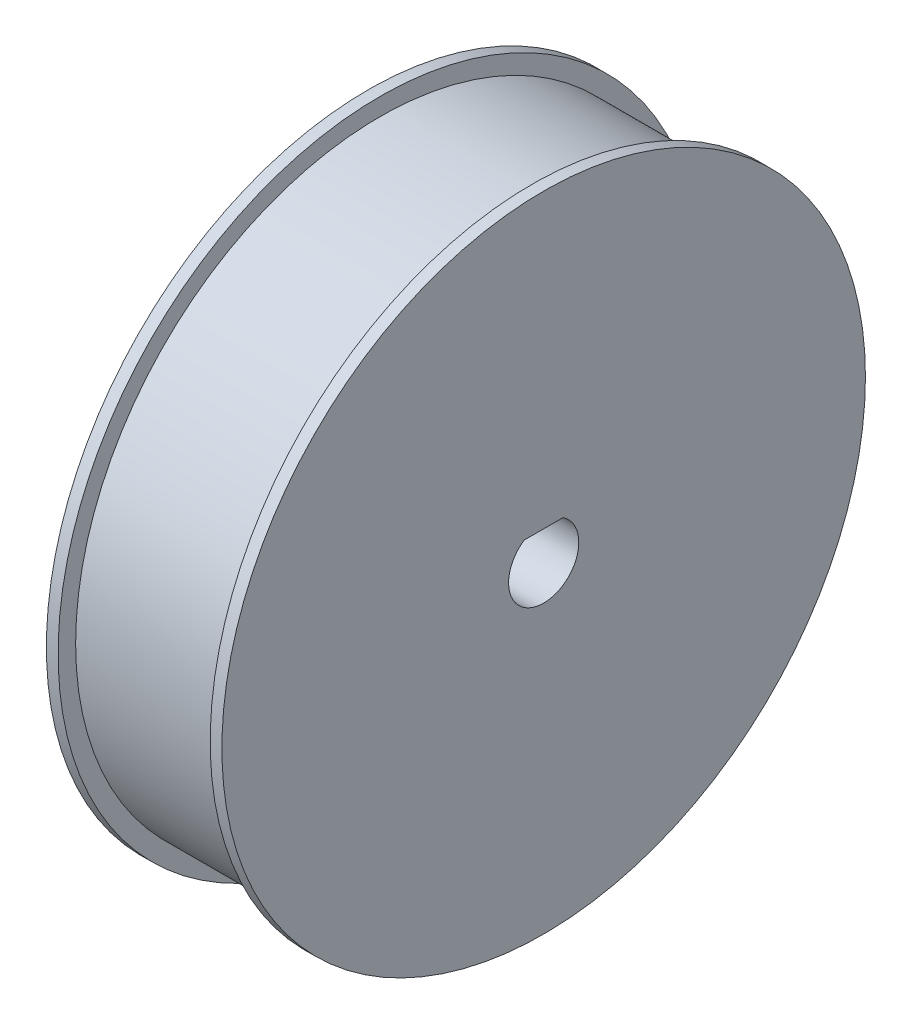
ISO-10303-21;
HEADER;
FILE_DESCRIPTION(('STEP AP214'),'2;1');
FILE_NAME('part.step','',(''),(''),'','','');
FILE_SCHEMA(('AUTOMOTIVE_DESIGN { 1 0 10303 214 1 1 1 1 }'));
ENDSEC;
DATA;
#1=APPLICATION_CONTEXT('core data for automotive mechanical design processes');
#2=APPLICATION_PROTOCOL_DEFINITION('international standard','automotive_design',2000,#1);
#3=PRODUCT_CONTEXT('',#1,'mechanical');
#4=PRODUCT('Part','Part','',(#3));
#5=PRODUCT_RELATED_PRODUCT_CATEGORY('part','',(#4));
#6=PRODUCT_DEFINITION_FORMATION('','',#4);
#7=PRODUCT_DEFINITION_CONTEXT('part definition',#1,'design');
#8=PRODUCT_DEFINITION('design','',#6,#7);
#9=PRODUCT_DEFINITION_SHAPE('','',#8);
#10=(LENGTH_UNIT() NAMED_UNIT(*) SI_UNIT(.MILLI.,.METRE.));
#11=(NAMED_UNIT(*) PLANE_ANGLE_UNIT() SI_UNIT($,.RADIAN.));
#12=(NAMED_UNIT(*) SI_UNIT($,.STERADIAN.) SOLID_ANGLE_UNIT());
#13=UNCERTAINTY_MEASURE_WITH_UNIT(LENGTH_MEASURE(1.E-05),#10,'distance_accuracy_value','');
#14=(GEOMETRIC_REPRESENTATION_CONTEXT(3) GLOBAL_UNCERTAINTY_ASSIGNED_CONTEXT((#13)) GLOBAL_UNIT_ASSIGNED_CONTEXT((#10,
#11,#12)) REPRESENTATION_CONTEXT('',''));
#15=CARTESIAN_POINT('',(0.,0.,0.));
#16=DIRECTION('',(0.,0.,1.));
#17=DIRECTION('',(1.,0.,0.));
#18=AXIS2_PLACEMENT_3D('',#15,#16,#17);
#19=CARTESIAN_POINT('',(-5.,0.,0.));
#20=DIRECTION('',(1.,0.,0.));
#21=DIRECTION('',(0.,0.,-1.));
#22=AXIS2_PLACEMENT_3D('',#19,#20,#21);
#23=CYLINDRICAL_SURFACE('',#22,27.5);
#24=CARTESIAN_POINT('',(-5.,0.,0.));
#25=DIRECTION('',(1.,0.,0.));
#26=DIRECTION('',(0.,0.,-1.));
#27=AXIS2_PLACEMENT_3D('',#24,#25,#26);
#28=CIRCLE('',#27,27.5);
#29=CARTESIAN_POINT('',(-5.,0.,-27.5));
#30=VERTEX_POINT('',#29);
#31=EDGE_CURVE('E11',#30,#30,#28,.T.);
#32=ORIENTED_EDGE('',*,*,#31,.T.);
#33=EDGE_LOOP('',(#32));
#34=FACE_BOUND('',#33,.T.);
#35=CARTESIAN_POINT('',(-4.,0.,0.));
#36=DIRECTION('',(1.,0.,0.));
#37=DIRECTION('',(0.,0.,-1.));
#38=AXIS2_PLACEMENT_3D('',#35,#36,#37);
#39=CIRCLE('',#38,27.5);
#40=CARTESIAN_POINT('',(-4.,0.,-27.5));
#41=VERTEX_POINT('',#40);
#42=EDGE_CURVE('E93',#41,#41,#39,.T.);
#43=ORIENTED_EDGE('',*,*,#42,.F.);
#44=EDGE_LOOP('',(#43));
#45=FACE_BOUND('',#44,.T.);
#46=ADVANCED_FACE('F33',(#34,#45),#23,.T.);
#47=CARTESIAN_POINT('',(9.,0.,0.));
#48=DIRECTION('',(1.,0.,0.));
#49=DIRECTION('',(0.,0.,-1.));
#50=AXIS2_PLACEMENT_3D('',#47,#48,#49);
#51=CIRCLE('',#50,27.5);
#52=CARTESIAN_POINT('',(9.,0.,-27.5));
#53=VERTEX_POINT('',#52);
#54=EDGE_CURVE('E72',#53,#53,#51,.T.);
#55=ORIENTED_EDGE('',*,*,#54,.T.);
#56=EDGE_LOOP('',(#55));
#57=FACE_BOUND('',#56,.T.);
#58=CARTESIAN_POINT('',(10.,0.,0.));
#59=DIRECTION('',(1.,0.,0.));
#60=DIRECTION('',(0.,0.,-1.));
#61=AXIS2_PLACEMENT_3D('',#58,#59,#60);
#62=CIRCLE('',#61,27.5);
#63=CARTESIAN_POINT('',(10.,0.,-27.5));
#64=VERTEX_POINT('',#63);
#65=EDGE_CURVE('E69',#64,#64,#62,.T.);
#66=ORIENTED_EDGE('',*,*,#65,.F.);
#67=EDGE_LOOP('',(#66));
#68=FACE_BOUND('',#67,.T.);
#69=ADVANCED_FACE('F35',(#57,#68),#23,.T.);
#70=CARTESIAN_POINT('',(-5.,0.,0.));
#71=DIRECTION('',(1.,0.,0.));
#72=DIRECTION('',(0.,0.,-1.));
#73=AXIS2_PLACEMENT_3D('',#70,#71,#72);
#74=PLANE('',#73);
#75=DIRECTION('',(0.,0.,1.));
#76=VECTOR('',#75,1.);
#77=CARTESIAN_POINT('',(-5.,2.5,1.6583123951777));
#78=LINE('',#77,#76);
#79=CARTESIAN_POINT('',(-5.,2.5,-1.6583123951777));
#80=VERTEX_POINT('',#79);
#81=CARTESIAN_POINT('',(-5.,2.5,1.6583123951777));
#82=VERTEX_POINT('',#81);
#83=EDGE_CURVE('E82',#80,#82,#78,.T.);
#84=ORIENTED_EDGE('',*,*,#83,.T.);
#85=CARTESIAN_POINT('',(-5.,0.,0.));
#86=DIRECTION('',(1.,0.,0.));
#87=DIRECTION('',(0.,0.,-1.));
#88=AXIS2_PLACEMENT_3D('',#85,#86,#87);
#89=CIRCLE('',#88,3.);
#90=EDGE_CURVE('E48',#82,#80,#89,.T.);
#91=ORIENTED_EDGE('',*,*,#90,.T.);
#92=EDGE_LOOP('',(#84,#91));
#93=FACE_BOUND('',#92,.T.);
#94=ORIENTED_EDGE('',*,*,#31,.F.);
#95=EDGE_LOOP('',(#94));
#96=FACE_BOUND('',#95,.T.);
#97=ADVANCED_FACE('F84',(#93,#96),#74,.F.);
#98=CARTESIAN_POINT('',(-5.,0.,0.));
#99=DIRECTION('',(1.,0.,0.));
#100=DIRECTION('',(0.,0.,-1.));
#101=AXIS2_PLACEMENT_3D('',#98,#99,#100);
#102=CYLINDRICAL_SURFACE('',#101,3.);
#103=DIRECTION('',(1.,0.,0.));
#104=VECTOR('',#103,1.);
#105=CARTESIAN_POINT('',(-5.,2.5,1.6583123951777));
#106=LINE('',#105,#104);
#107=CARTESIAN_POINT('',(10.,2.5,1.6583123951777));
#108=VERTEX_POINT('',#107);
#109=EDGE_CURVE('E41',#82,#108,#106,.T.);
#110=ORIENTED_EDGE('',*,*,#109,.T.);
#111=CARTESIAN_POINT('',(10.,0.,0.));
#112=DIRECTION('',(1.,0.,0.));
#113=DIRECTION('',(0.,0.,-1.));
#114=AXIS2_PLACEMENT_3D('',#111,#112,#113);
#115=CIRCLE('',#114,3.);
#116=CARTESIAN_POINT('',(10.,2.5,-1.6583123951777));
#117=VERTEX_POINT('',#116);
#118=EDGE_CURVE('E61',#108,#117,#115,.T.);
#119=ORIENTED_EDGE('',*,*,#118,.T.);
#120=DIRECTION('',(1.,0.,0.));
#121=VECTOR('',#120,1.);
#122=CARTESIAN_POINT('',(-5.,2.5,-1.6583123951777));
#123=LINE('',#122,#121);
#124=EDGE_CURVE('E53',#80,#117,#123,.T.);
#125=ORIENTED_EDGE('',*,*,#124,.F.);
#126=ORIENTED_EDGE('',*,*,#90,.F.);
#127=EDGE_LOOP('',(#110,#119,#125,#126));
#128=FACE_BOUND('',#127,.T.);
#129=ADVANCED_FACE('F59',(#128),#102,.F.);
#130=CARTESIAN_POINT('',(-5.,2.5,1.6583123951777));
#131=DIRECTION('',(0.,1.,0.));
#132=DIRECTION('',(0.,0.,1.));
#133=AXIS2_PLACEMENT_3D('',#130,#131,#132);
#134=PLANE('',#133);
#135=ORIENTED_EDGE('',*,*,#124,.T.);
#136=DIRECTION('',(0.,0.,1.));
#137=VECTOR('',#136,1.);
#138=CARTESIAN_POINT('',(10.,2.5,1.6583123951777));
#139=LINE('',#138,#137);
#140=EDGE_CURVE('E66',#117,#108,#139,.T.);
#141=ORIENTED_EDGE('',*,*,#140,.T.);
#142=ORIENTED_EDGE('',*,*,#109,.F.);
#143=ORIENTED_EDGE('',*,*,#83,.F.);
#144=EDGE_LOOP('',(#135,#141,#142,#143));
#145=FACE_BOUND('',#144,.T.);
#146=ADVANCED_FACE('F67',(#145),#134,.F.);
#147=CARTESIAN_POINT('',(10.,0.,0.));
#148=DIRECTION('',(1.,0.,0.));
#149=DIRECTION('',(0.,0.,-1.));
#150=AXIS2_PLACEMENT_3D('',#147,#148,#149);
#151=PLANE('',#150);
#152=ORIENTED_EDGE('',*,*,#65,.T.);
#153=EDGE_LOOP('',(#152));
#154=FACE_BOUND('',#153,.T.);
#155=ORIENTED_EDGE('',*,*,#140,.F.);
#156=ORIENTED_EDGE('',*,*,#118,.F.);
#157=EDGE_LOOP('',(#155,#156));
#158=FACE_BOUND('',#157,.T.);
#159=ADVANCED_FACE('F71',(#154,#158),#151,.T.);
#160=CARTESIAN_POINT('',(9.,0.,0.));
#161=DIRECTION('',(1.,0.,0.));
#162=DIRECTION('',(0.,0.,-1.));
#163=AXIS2_PLACEMENT_3D('',#160,#161,#162);
#164=PLANE('',#163);
#165=ORIENTED_EDGE('',*,*,#54,.F.);
#166=EDGE_LOOP('',(#165));
#167=FACE_BOUND('',#166,.T.);
#168=CARTESIAN_POINT('',(9.,0.,0.));
#169=DIRECTION('',(1.,0.,0.));
#170=DIRECTION('',(0.,0.,-1.));
#171=AXIS2_PLACEMENT_3D('',#168,#169,#170);
#172=CIRCLE('',#171,26.);
#173=CARTESIAN_POINT('',(9.,0.,-26.));
#174=VERTEX_POINT('',#173);
#175=EDGE_CURVE('E75',#174,#174,#172,.T.);
#176=ORIENTED_EDGE('',*,*,#175,.T.);
#177=EDGE_LOOP('',(#176));
#178=FACE_BOUND('',#177,.T.);
#179=ADVANCED_FACE('F110',(#167,#178),#164,.F.);
#180=CARTESIAN_POINT('',(9.,0.,0.));
#181=DIRECTION('',(-1.,0.,0.));
#182=DIRECTION('',(0.,0.,1.));
#183=AXIS2_PLACEMENT_3D('',#180,#181,#182);
#184=CYLINDRICAL_SURFACE('',#183,26.);
#185=ORIENTED_EDGE('',*,*,#175,.F.);
#186=EDGE_LOOP('',(#185));
#187=FACE_BOUND('',#186,.T.);
#188=CARTESIAN_POINT('',(-4.,0.,0.));
#189=DIRECTION('',(1.,0.,0.));
#190=DIRECTION('',(0.,0.,-1.));
#191=AXIS2_PLACEMENT_3D('',#188,#189,#190);
#192=CIRCLE('',#191,26.);
#193=CARTESIAN_POINT('',(-4.,0.,-26.));
#194=VERTEX_POINT('',#193);
#195=EDGE_CURVE('E95',#194,#194,#192,.T.);
#196=ORIENTED_EDGE('',*,*,#195,.T.);
#197=EDGE_LOOP('',(#196));
#198=FACE_BOUND('',#197,.T.);
#199=ADVANCED_FACE('F102',(#187,#198),#184,.T.);
#200=CARTESIAN_POINT('',(-4.,0.,0.));
#201=DIRECTION('',(1.,0.,0.));
#202=DIRECTION('',(0.,0.,-1.));
#203=AXIS2_PLACEMENT_3D('',#200,#201,#202);
#204=PLANE('',#203);
#205=ORIENTED_EDGE('',*,*,#195,.F.);
#206=EDGE_LOOP('',(#205));
#207=FACE_BOUND('',#206,.T.);
#208=ORIENTED_EDGE('',*,*,#42,.T.);
#209=EDGE_LOOP('',(#208));
#210=FACE_BOUND('',#209,.T.);
#211=ADVANCED_FACE('F104',(#207,#210),#204,.T.);
#212=CLOSED_SHELL('',(#46,#69,#97,#129,#146,#159,#179,#199,#211));
#213=MANIFOLD_SOLID_BREP('B2',#212);
#214=ADVANCED_BREP_SHAPE_REPRESENTATION('',(#18,#213),#14);
#215=SHAPE_DEFINITION_REPRESENTATION(#9,#214);
ENDSEC;
END-ISO-10303-21;
